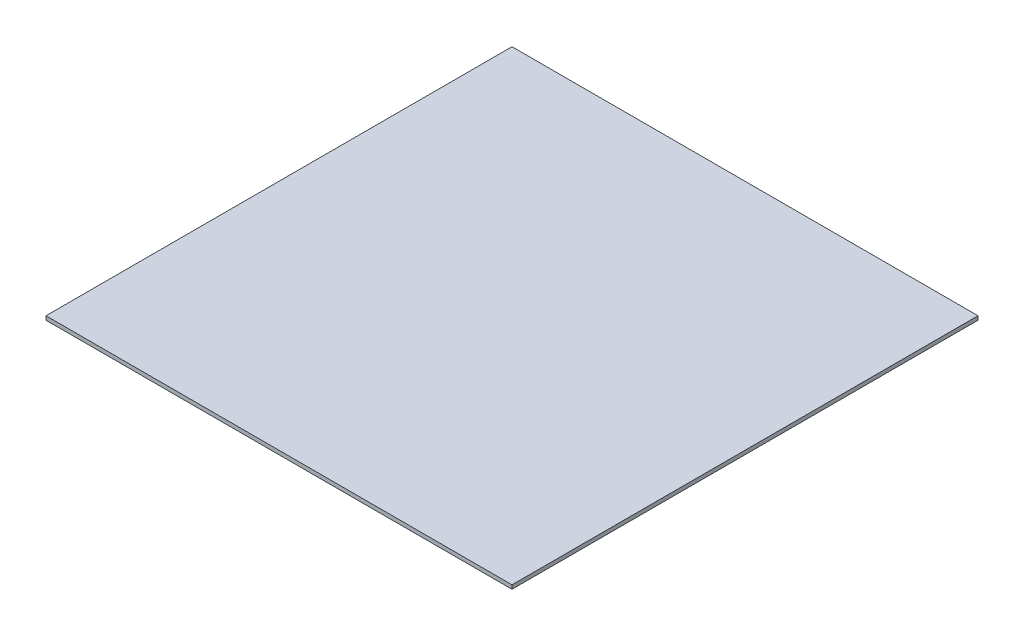
ISO-10303-21;
HEADER;
FILE_DESCRIPTION(('STEP AP214'),'2;1');
FILE_NAME('part.step','',(''),(''),'','','');
FILE_SCHEMA(('AUTOMOTIVE_DESIGN { 1 0 10303 214 1 1 1 1 }'));
ENDSEC;
DATA;
#1=APPLICATION_CONTEXT('core data for automotive mechanical design processes');
#2=APPLICATION_PROTOCOL_DEFINITION('international standard','automotive_design',2000,#1);
#3=PRODUCT_CONTEXT('',#1,'mechanical');
#4=PRODUCT('Part','Part','',(#3));
#5=PRODUCT_RELATED_PRODUCT_CATEGORY('part','',(#4));
#6=PRODUCT_DEFINITION_FORMATION('','',#4);
#7=PRODUCT_DEFINITION_CONTEXT('part definition',#1,'design');
#8=PRODUCT_DEFINITION('design','',#6,#7);
#9=PRODUCT_DEFINITION_SHAPE('','',#8);
#10=(LENGTH_UNIT() NAMED_UNIT(*) SI_UNIT(.MILLI.,.METRE.));
#11=(NAMED_UNIT(*) PLANE_ANGLE_UNIT() SI_UNIT($,.RADIAN.));
#12=(NAMED_UNIT(*) SI_UNIT($,.STERADIAN.) SOLID_ANGLE_UNIT());
#13=UNCERTAINTY_MEASURE_WITH_UNIT(LENGTH_MEASURE(1.E-05),#10,'distance_accuracy_value','');
#14=(GEOMETRIC_REPRESENTATION_CONTEXT(3) GLOBAL_UNCERTAINTY_ASSIGNED_CONTEXT((#13)) GLOBAL_UNIT_ASSIGNED_CONTEXT((#10,
#11,#12)) REPRESENTATION_CONTEXT('',''));
#15=CARTESIAN_POINT('',(0.,0.,0.));
#16=DIRECTION('',(0.,0.,1.));
#17=DIRECTION('',(1.,0.,0.));
#18=AXIS2_PLACEMENT_3D('',#15,#16,#17);
#19=CARTESIAN_POINT('',(-381.,6.35,381.));
#20=DIRECTION('',(1.,0.,0.));
#21=DIRECTION('',(0.,0.,-1.));
#22=AXIS2_PLACEMENT_3D('',#19,#20,#21);
#23=PLANE('',#22);
#24=DIRECTION('',(0.,0.,1.));
#25=VECTOR('',#24,1.);
#26=CARTESIAN_POINT('',(-381.,0.,381.));
#27=LINE('',#26,#25);
#28=CARTESIAN_POINT('',(-381.,0.,-381.));
#29=VERTEX_POINT('',#28);
#30=CARTESIAN_POINT('',(-381.,0.,381.));
#31=VERTEX_POINT('',#30);
#32=EDGE_CURVE('E98',#29,#31,#27,.T.);
#33=ORIENTED_EDGE('',*,*,#32,.T.);
#34=DIRECTION('',(0.,-1.,0.));
#35=VECTOR('',#34,1.);
#36=CARTESIAN_POINT('',(-381.,6.35,381.));
#37=LINE('',#36,#35);
#38=CARTESIAN_POINT('',(-381.,6.35,381.));
#39=VERTEX_POINT('',#38);
#40=EDGE_CURVE('E11',#39,#31,#37,.T.);
#41=ORIENTED_EDGE('',*,*,#40,.F.);
#42=DIRECTION('',(0.,0.,1.));
#43=VECTOR('',#42,1.);
#44=CARTESIAN_POINT('',(-381.,6.35,381.));
#45=LINE('',#44,#43);
#46=CARTESIAN_POINT('',(-381.,6.35,-381.));
#47=VERTEX_POINT('',#46);
#48=EDGE_CURVE('E86',#47,#39,#45,.T.);
#49=ORIENTED_EDGE('',*,*,#48,.F.);
#50=DIRECTION('',(0.,-1.,0.));
#51=VECTOR('',#50,1.);
#52=CARTESIAN_POINT('',(-381.,6.35,-381.));
#53=LINE('',#52,#51);
#54=EDGE_CURVE('E94',#47,#29,#53,.T.);
#55=ORIENTED_EDGE('',*,*,#54,.T.);
#56=EDGE_LOOP('',(#33,#41,#49,#55));
#57=FACE_BOUND('',#56,.T.);
#58=ADVANCED_FACE('F35',(#57),#23,.F.);
#59=CARTESIAN_POINT('',(381.,6.35,381.));
#60=DIRECTION('',(0.,0.,-1.));
#61=DIRECTION('',(-1.,0.,0.));
#62=AXIS2_PLACEMENT_3D('',#59,#60,#61);
#63=PLANE('',#62);
#64=DIRECTION('',(1.,0.,0.));
#65=VECTOR('',#64,1.);
#66=CARTESIAN_POINT('',(381.,0.,381.));
#67=LINE('',#66,#65);
#68=CARTESIAN_POINT('',(381.,0.,381.));
#69=VERTEX_POINT('',#68);
#70=EDGE_CURVE('E90',#31,#69,#67,.T.);
#71=ORIENTED_EDGE('',*,*,#70,.T.);
#72=DIRECTION('',(0.,-1.,0.));
#73=VECTOR('',#72,1.);
#74=CARTESIAN_POINT('',(381.,6.35,381.));
#75=LINE('',#74,#73);
#76=CARTESIAN_POINT('',(381.,6.35,381.));
#77=VERTEX_POINT('',#76);
#78=EDGE_CURVE('E43',#77,#69,#75,.T.);
#79=ORIENTED_EDGE('',*,*,#78,.F.);
#80=DIRECTION('',(1.,0.,0.));
#81=VECTOR('',#80,1.);
#82=CARTESIAN_POINT('',(381.,6.35,381.));
#83=LINE('',#82,#81);
#84=EDGE_CURVE('E81',#39,#77,#83,.T.);
#85=ORIENTED_EDGE('',*,*,#84,.F.);
#86=ORIENTED_EDGE('',*,*,#40,.T.);
#87=EDGE_LOOP('',(#71,#79,#85,#86));
#88=FACE_BOUND('',#87,.T.);
#89=ADVANCED_FACE('F89',(#88),#63,.F.);
#90=CARTESIAN_POINT('',(381.,6.35,381.));
#91=DIRECTION('',(-1.,0.,0.));
#92=DIRECTION('',(0.,0.,1.));
#93=AXIS2_PLACEMENT_3D('',#90,#91,#92);
#94=PLANE('',#93);
#95=DIRECTION('',(0.,0.,-1.));
#96=VECTOR('',#95,1.);
#97=CARTESIAN_POINT('',(381.,0.,381.));
#98=LINE('',#97,#96);
#99=CARTESIAN_POINT('',(381.,0.,-381.));
#100=VERTEX_POINT('',#99);
#101=EDGE_CURVE('E68',#69,#100,#98,.T.);
#102=ORIENTED_EDGE('',*,*,#101,.T.);
#103=DIRECTION('',(0.,-1.,0.));
#104=VECTOR('',#103,1.);
#105=CARTESIAN_POINT('',(381.,6.35,-381.));
#106=LINE('',#105,#104);
#107=CARTESIAN_POINT('',(381.,6.35,-381.));
#108=VERTEX_POINT('',#107);
#109=EDGE_CURVE('E91',#108,#100,#106,.T.);
#110=ORIENTED_EDGE('',*,*,#109,.F.);
#111=DIRECTION('',(0.,0.,-1.));
#112=VECTOR('',#111,1.);
#113=CARTESIAN_POINT('',(381.,6.35,381.));
#114=LINE('',#113,#112);
#115=EDGE_CURVE('E84',#77,#108,#114,.T.);
#116=ORIENTED_EDGE('',*,*,#115,.F.);
#117=ORIENTED_EDGE('',*,*,#78,.T.);
#118=EDGE_LOOP('',(#102,#110,#116,#117));
#119=FACE_BOUND('',#118,.T.);
#120=ADVANCED_FACE('F92',(#119),#94,.F.);
#121=CARTESIAN_POINT('',(381.,6.35,-381.));
#122=DIRECTION('',(0.,0.,1.));
#123=DIRECTION('',(1.,0.,0.));
#124=AXIS2_PLACEMENT_3D('',#121,#122,#123);
#125=PLANE('',#124);
#126=DIRECTION('',(-1.,0.,0.));
#127=VECTOR('',#126,1.);
#128=CARTESIAN_POINT('',(381.,0.,-381.));
#129=LINE('',#128,#127);
#130=EDGE_CURVE('E74',#100,#29,#129,.T.);
#131=ORIENTED_EDGE('',*,*,#130,.T.);
#132=ORIENTED_EDGE('',*,*,#54,.F.);
#133=DIRECTION('',(-1.,0.,0.));
#134=VECTOR('',#133,1.);
#135=CARTESIAN_POINT('',(381.,6.35,-381.));
#136=LINE('',#135,#134);
#137=EDGE_CURVE('E51',#108,#47,#136,.T.);
#138=ORIENTED_EDGE('',*,*,#137,.F.);
#139=ORIENTED_EDGE('',*,*,#109,.T.);
#140=EDGE_LOOP('',(#131,#132,#138,#139));
#141=FACE_BOUND('',#140,.T.);
#142=ADVANCED_FACE('F105',(#141),#125,.F.);
#143=CARTESIAN_POINT('',(0.,6.35,0.));
#144=DIRECTION('',(0.,1.,0.));
#145=DIRECTION('',(0.,0.,1.));
#146=AXIS2_PLACEMENT_3D('',#143,#144,#145);
#147=PLANE('',#146);
#148=ORIENTED_EDGE('',*,*,#48,.T.);
#149=ORIENTED_EDGE('',*,*,#84,.T.);
#150=ORIENTED_EDGE('',*,*,#115,.T.);
#151=ORIENTED_EDGE('',*,*,#137,.T.);
#152=EDGE_LOOP('',(#148,#149,#150,#151));
#153=FACE_BOUND('',#152,.T.);
#154=ADVANCED_FACE('F82',(#153),#147,.T.);
#155=CARTESIAN_POINT('',(0.,0.,0.));
#156=DIRECTION('',(0.,1.,0.));
#157=DIRECTION('',(0.,0.,1.));
#158=AXIS2_PLACEMENT_3D('',#155,#156,#157);
#159=PLANE('',#158);
#160=ORIENTED_EDGE('',*,*,#32,.F.);
#161=ORIENTED_EDGE('',*,*,#130,.F.);
#162=ORIENTED_EDGE('',*,*,#101,.F.);
#163=ORIENTED_EDGE('',*,*,#70,.F.);
#164=EDGE_LOOP('',(#160,#161,#162,#163));
#165=FACE_BOUND('',#164,.T.);
#166=ADVANCED_FACE('F108',(#165),#159,.F.);
#167=CLOSED_SHELL('',(#58,#89,#120,#142,#154,#166));
#168=MANIFOLD_SOLID_BREP('B2',#167);
#169=ADVANCED_BREP_SHAPE_REPRESENTATION('',(#18,#168),#14);
#170=SHAPE_DEFINITION_REPRESENTATION(#9,#169);
ENDSEC;
END-ISO-10303-21;
